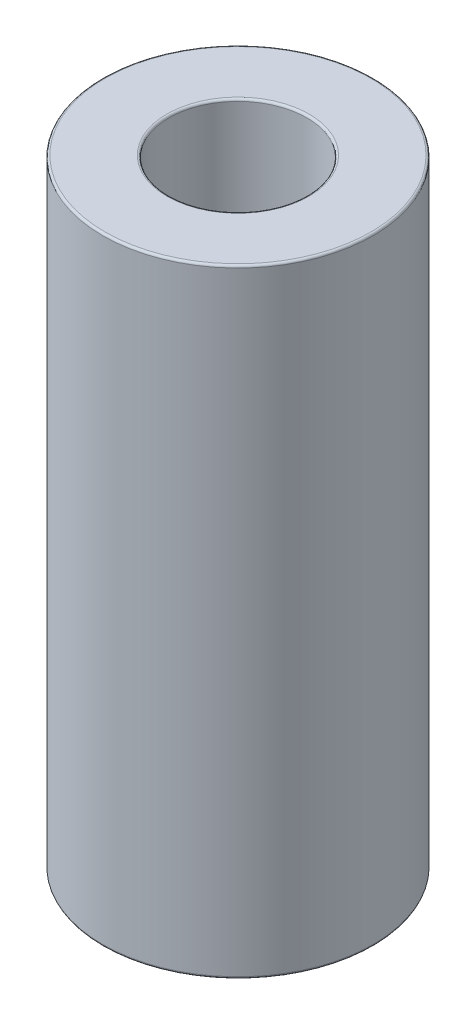
ISO-10303-21;
HEADER;
FILE_DESCRIPTION(('STEP AP214'),'2;1');
FILE_NAME('part.step','',(''),(''),'','','');
FILE_SCHEMA(('AUTOMOTIVE_DESIGN { 1 0 10303 214 1 1 1 1 }'));
ENDSEC;
DATA;
#1=APPLICATION_CONTEXT('core data for automotive mechanical design processes');
#2=APPLICATION_PROTOCOL_DEFINITION('international standard','automotive_design',2000,#1);
#3=PRODUCT_CONTEXT('',#1,'mechanical');
#4=PRODUCT('Part','Part','',(#3));
#5=PRODUCT_RELATED_PRODUCT_CATEGORY('part','',(#4));
#6=PRODUCT_DEFINITION_FORMATION('','',#4);
#7=PRODUCT_DEFINITION_CONTEXT('part definition',#1,'design');
#8=PRODUCT_DEFINITION('design','',#6,#7);
#9=PRODUCT_DEFINITION_SHAPE('','',#8);
#10=(LENGTH_UNIT() NAMED_UNIT(*) SI_UNIT(.MILLI.,.METRE.));
#11=(NAMED_UNIT(*) PLANE_ANGLE_UNIT() SI_UNIT($,.RADIAN.));
#12=(NAMED_UNIT(*) SI_UNIT($,.STERADIAN.) SOLID_ANGLE_UNIT());
#13=UNCERTAINTY_MEASURE_WITH_UNIT(LENGTH_MEASURE(1.E-05),#10,'distance_accuracy_value','');
#14=(GEOMETRIC_REPRESENTATION_CONTEXT(3) GLOBAL_UNCERTAINTY_ASSIGNED_CONTEXT((#13)) GLOBAL_UNIT_ASSIGNED_CONTEXT((#10,
#11,#12)) REPRESENTATION_CONTEXT('',''));
#15=CARTESIAN_POINT('',(0.,0.,0.));
#16=DIRECTION('',(0.,0.,1.));
#17=DIRECTION('',(1.,0.,0.));
#18=AXIS2_PLACEMENT_3D('',#15,#16,#17);
#19=CARTESIAN_POINT('',(0.,28.,0.));
#20=DIRECTION('',(0.,1.,0.));
#21=DIRECTION('',(0.,0.,1.));
#22=AXIS2_PLACEMENT_3D('',#19,#20,#21);
#23=PLANE('',#22);
#24=CARTESIAN_POINT('',(0.,28.,0.));
#25=DIRECTION('',(0.,1.,0.));
#26=DIRECTION('',(0.,0.,1.));
#27=AXIS2_PLACEMENT_3D('',#24,#25,#26);
#28=CIRCLE('',#27,3.225);
#29=CARTESIAN_POINT('',(0.,28.,3.225));
#30=VERTEX_POINT('',#29);
#31=EDGE_CURVE('E56',#30,#30,#28,.F.);
#32=ORIENTED_EDGE('',*,*,#31,.T.);
#33=EDGE_LOOP('',(#32));
#34=FACE_BOUND('',#33,.T.);
#35=CARTESIAN_POINT('',(0.,28.,0.));
#36=DIRECTION('',(0.,1.,0.));
#37=DIRECTION('',(0.,0.,1.));
#38=AXIS2_PLACEMENT_3D('',#35,#36,#37);
#39=CIRCLE('',#38,6.025);
#40=CARTESIAN_POINT('',(0.,28.,6.025));
#41=VERTEX_POINT('',#40);
#42=EDGE_CURVE('E59',#41,#41,#39,.T.);
#43=ORIENTED_EDGE('',*,*,#42,.T.);
#44=EDGE_LOOP('',(#43));
#45=FACE_BOUND('',#44,.T.);
#46=ADVANCED_FACE('F36',(#34,#45),#23,.T.);
#47=CARTESIAN_POINT('',(0.,0.,0.));
#48=DIRECTION('',(0.,1.,0.));
#49=DIRECTION('',(0.,0.,1.));
#50=AXIS2_PLACEMENT_3D('',#47,#48,#49);
#51=PLANE('',#50);
#52=CARTESIAN_POINT('',(0.,0.,0.));
#53=DIRECTION('',(0.,1.,0.));
#54=DIRECTION('',(0.,0.,1.));
#55=AXIS2_PLACEMENT_3D('',#52,#53,#54);
#56=CIRCLE('',#55,3.225);
#57=CARTESIAN_POINT('',(0.,0.,3.225));
#58=VERTEX_POINT('',#57);
#59=EDGE_CURVE('E11',#58,#58,#56,.T.);
#60=ORIENTED_EDGE('',*,*,#59,.T.);
#61=EDGE_LOOP('',(#60));
#62=FACE_BOUND('',#61,.T.);
#63=CARTESIAN_POINT('',(0.,0.,0.));
#64=DIRECTION('',(0.,1.,0.));
#65=DIRECTION('',(0.,0.,1.));
#66=AXIS2_PLACEMENT_3D('',#63,#64,#65);
#67=CIRCLE('',#66,6.025);
#68=CARTESIAN_POINT('',(0.,0.,6.025));
#69=VERTEX_POINT('',#68);
#70=EDGE_CURVE('E43',#69,#69,#67,.F.);
#71=ORIENTED_EDGE('',*,*,#70,.T.);
#72=EDGE_LOOP('',(#71));
#73=FACE_BOUND('',#72,.T.);
#74=ADVANCED_FACE('F84',(#62,#73),#51,.F.);
#75=CARTESIAN_POINT('',(0.,28.,0.));
#76=DIRECTION('',(0.,-1.,0.));
#77=DIRECTION('',(0.,0.,-1.));
#78=AXIS2_PLACEMENT_3D('',#75,#76,#77);
#79=CYLINDRICAL_SURFACE('',#78,6.125);
#80=CARTESIAN_POINT('',(0.,27.9,0.));
#81=DIRECTION('',(0.,1.,0.));
#82=DIRECTION('',(0.,0.,1.));
#83=AXIS2_PLACEMENT_3D('',#80,#81,#82);
#84=CIRCLE('',#83,6.125);
#85=CARTESIAN_POINT('',(0.,27.9,6.125));
#86=VERTEX_POINT('',#85);
#87=EDGE_CURVE('E47',#86,#86,#84,.F.);
#88=ORIENTED_EDGE('',*,*,#87,.T.);
#89=EDGE_LOOP('',(#88));
#90=FACE_BOUND('',#89,.T.);
#91=CARTESIAN_POINT('',(0.,0.0999999999999994,0.));
#92=DIRECTION('',(0.,1.,0.));
#93=DIRECTION('',(0.,0.,1.));
#94=AXIS2_PLACEMENT_3D('',#91,#92,#93);
#95=CIRCLE('',#94,6.125);
#96=CARTESIAN_POINT('',(0.,0.0999999999999994,6.125));
#97=VERTEX_POINT('',#96);
#98=EDGE_CURVE('E51',#97,#97,#95,.T.);
#99=ORIENTED_EDGE('',*,*,#98,.T.);
#100=EDGE_LOOP('',(#99));
#101=FACE_BOUND('',#100,.T.);
#102=ADVANCED_FACE('F90',(#90,#101),#79,.T.);
#103=CARTESIAN_POINT('',(0.,28.,0.));
#104=DIRECTION('',(0.,-1.,0.));
#105=DIRECTION('',(0.,0.,-1.));
#106=AXIS2_PLACEMENT_3D('',#103,#104,#105);
#107=CYLINDRICAL_SURFACE('',#106,3.125);
#108=CARTESIAN_POINT('',(0.,27.9,0.));
#109=DIRECTION('',(0.,1.,0.));
#110=DIRECTION('',(0.,0.,1.));
#111=AXIS2_PLACEMENT_3D('',#108,#109,#110);
#112=CIRCLE('',#111,3.125);
#113=CARTESIAN_POINT('',(0.,27.9,3.125));
#114=VERTEX_POINT('',#113);
#115=EDGE_CURVE('E62',#114,#114,#112,.T.);
#116=ORIENTED_EDGE('',*,*,#115,.T.);
#117=EDGE_LOOP('',(#116));
#118=FACE_BOUND('',#117,.T.);
#119=CARTESIAN_POINT('',(0.,0.0999999999999994,0.));
#120=DIRECTION('',(0.,1.,0.));
#121=DIRECTION('',(0.,0.,1.));
#122=AXIS2_PLACEMENT_3D('',#119,#120,#121);
#123=CIRCLE('',#122,3.125);
#124=CARTESIAN_POINT('',(0.,0.0999999999999994,3.125));
#125=VERTEX_POINT('',#124);
#126=EDGE_CURVE('E65',#125,#125,#123,.F.);
#127=ORIENTED_EDGE('',*,*,#126,.T.);
#128=EDGE_LOOP('',(#127));
#129=FACE_BOUND('',#128,.T.);
#130=ADVANCED_FACE('F69',(#118,#129),#107,.F.);
#131=CARTESIAN_POINT('',(0.,27.9,0.));
#132=DIRECTION('',(0.,1.,0.));
#133=DIRECTION('',(0.,0.,1.));
#134=AXIS2_PLACEMENT_3D('',#131,#132,#133);
#135=TOROIDAL_SURFACE('',#134,3.225,0.1);
#136=ORIENTED_EDGE('',*,*,#31,.F.);
#137=EDGE_LOOP('',(#136));
#138=FACE_BOUND('',#137,.T.);
#139=ORIENTED_EDGE('',*,*,#115,.F.);
#140=EDGE_LOOP('',(#139));
#141=FACE_BOUND('',#140,.T.);
#142=ADVANCED_FACE('F80',(#138,#141),#135,.T.);
#143=CARTESIAN_POINT('',(0.,27.9,0.));
#144=DIRECTION('',(0.,1.,0.));
#145=DIRECTION('',(0.,0.,1.));
#146=AXIS2_PLACEMENT_3D('',#143,#144,#145);
#147=TOROIDAL_SURFACE('',#146,6.025,0.1);
#148=ORIENTED_EDGE('',*,*,#87,.F.);
#149=EDGE_LOOP('',(#148));
#150=FACE_BOUND('',#149,.T.);
#151=ORIENTED_EDGE('',*,*,#42,.F.);
#152=EDGE_LOOP('',(#151));
#153=FACE_BOUND('',#152,.T.);
#154=ADVANCED_FACE('F74',(#150,#153),#147,.T.);
#155=CARTESIAN_POINT('',(0.,0.0999999999999994,0.));
#156=DIRECTION('',(0.,1.,0.));
#157=DIRECTION('',(0.,0.,1.));
#158=AXIS2_PLACEMENT_3D('',#155,#156,#157);
#159=TOROIDAL_SURFACE('',#158,3.225,0.1);
#160=ORIENTED_EDGE('',*,*,#126,.F.);
#161=EDGE_LOOP('',(#160));
#162=FACE_BOUND('',#161,.T.);
#163=ORIENTED_EDGE('',*,*,#59,.F.);
#164=EDGE_LOOP('',(#163));
#165=FACE_BOUND('',#164,.T.);
#166=ADVANCED_FACE('F71',(#162,#165),#159,.T.);
#167=CARTESIAN_POINT('',(0.,0.0999999999999994,0.));
#168=DIRECTION('',(0.,1.,0.));
#169=DIRECTION('',(0.,0.,1.));
#170=AXIS2_PLACEMENT_3D('',#167,#168,#169);
#171=TOROIDAL_SURFACE('',#170,6.025,0.1);
#172=ORIENTED_EDGE('',*,*,#70,.F.);
#173=EDGE_LOOP('',(#172));
#174=FACE_BOUND('',#173,.T.);
#175=ORIENTED_EDGE('',*,*,#98,.F.);
#176=EDGE_LOOP('',(#175));
#177=FACE_BOUND('',#176,.T.);
#178=ADVANCED_FACE('F38',(#174,#177),#171,.T.);
#179=CLOSED_SHELL('',(#46,#74,#102,#130,#142,#154,#166,#178));
#180=MANIFOLD_SOLID_BREP('B2',#179);
#181=ADVANCED_BREP_SHAPE_REPRESENTATION('',(#18,#180),#14);
#182=SHAPE_DEFINITION_REPRESENTATION(#9,#181);
ENDSEC;
END-ISO-10303-21;
